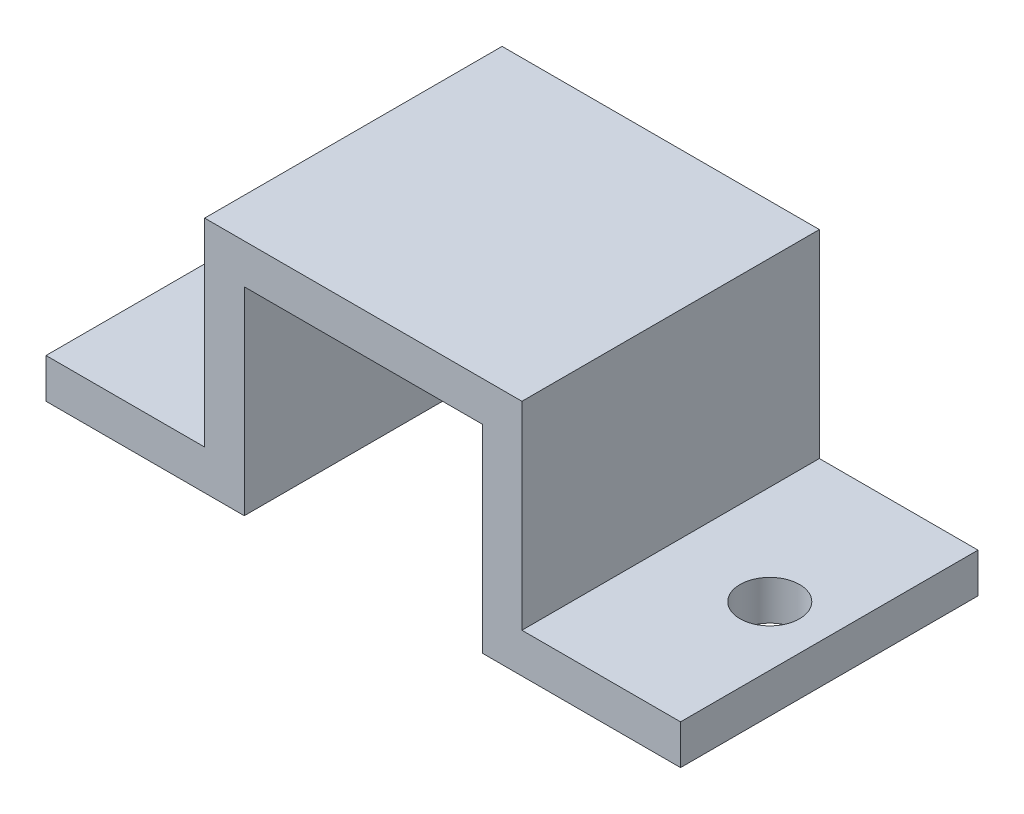
ISO-10303-21;
HEADER;
FILE_DESCRIPTION(('STEP AP214'),'2;1');
FILE_NAME('part.step','',(''),(''),'','','');
FILE_SCHEMA(('AUTOMOTIVE_DESIGN { 1 0 10303 214 1 1 1 1 }'));
ENDSEC;
DATA;
#1=APPLICATION_CONTEXT('core data for automotive mechanical design processes');
#2=APPLICATION_PROTOCOL_DEFINITION('international standard','automotive_design',2000,#1);
#3=PRODUCT_CONTEXT('',#1,'mechanical');
#4=PRODUCT('Part','Part','',(#3));
#5=PRODUCT_RELATED_PRODUCT_CATEGORY('part','',(#4));
#6=PRODUCT_DEFINITION_FORMATION('','',#4);
#7=PRODUCT_DEFINITION_CONTEXT('part definition',#1,'design');
#8=PRODUCT_DEFINITION('design','',#6,#7);
#9=PRODUCT_DEFINITION_SHAPE('','',#8);
#10=(LENGTH_UNIT() NAMED_UNIT(*) SI_UNIT(.MILLI.,.METRE.));
#11=(NAMED_UNIT(*) PLANE_ANGLE_UNIT() SI_UNIT($,.RADIAN.));
#12=(NAMED_UNIT(*) SI_UNIT($,.STERADIAN.) SOLID_ANGLE_UNIT());
#13=UNCERTAINTY_MEASURE_WITH_UNIT(LENGTH_MEASURE(1.E-05),#10,'distance_accuracy_value','');
#14=(GEOMETRIC_REPRESENTATION_CONTEXT(3) GLOBAL_UNCERTAINTY_ASSIGNED_CONTEXT((#13)) GLOBAL_UNIT_ASSIGNED_CONTEXT((#10,
#11,#12)) REPRESENTATION_CONTEXT('',''));
#15=CARTESIAN_POINT('',(0.,0.,0.));
#16=DIRECTION('',(0.,0.,1.));
#17=DIRECTION('',(1.,0.,0.));
#18=AXIS2_PLACEMENT_3D('',#15,#16,#17);
#19=CARTESIAN_POINT('',(0.,-4.,15.));
#20=DIRECTION('',(0.,1.,0.));
#21=DIRECTION('',(0.,0.,1.));
#22=AXIS2_PLACEMENT_3D('',#19,#20,#21);
#23=PLANE('',#22);
#24=CARTESIAN_POINT('',(13.,-4.,7.5));
#25=DIRECTION('',(0.,1.,0.));
#26=DIRECTION('',(0.,0.,1.));
#27=AXIS2_PLACEMENT_3D('',#24,#25,#26);
#28=CIRCLE('',#27,1.5);
#29=CARTESIAN_POINT('',(13.,-4.,9.));
#30=VERTEX_POINT('',#29);
#31=EDGE_CURVE('E202',#30,#30,#28,.T.);
#32=ORIENTED_EDGE('',*,*,#31,.F.);
#33=EDGE_LOOP('',(#32));
#34=FACE_BOUND('',#33,.T.);
#35=DIRECTION('',(1.,0.,0.));
#36=VECTOR('',#35,1.);
#37=CARTESIAN_POINT('',(0.,-4.,0.));
#38=LINE('',#37,#36);
#39=CARTESIAN_POINT('',(8.,-4.,0.));
#40=VERTEX_POINT('',#39);
#41=CARTESIAN_POINT('',(16.,-4.,0.));
#42=VERTEX_POINT('',#41);
#43=EDGE_CURVE('E213',#40,#42,#38,.T.);
#44=ORIENTED_EDGE('',*,*,#43,.F.);
#45=DIRECTION('',(0.,0.,-1.));
#46=VECTOR('',#45,1.);
#47=CARTESIAN_POINT('',(8.,-4.,15.));
#48=LINE('',#47,#46);
#49=CARTESIAN_POINT('',(8.,-4.,15.));
#50=VERTEX_POINT('',#49);
#51=EDGE_CURVE('E11',#50,#40,#48,.T.);
#52=ORIENTED_EDGE('',*,*,#51,.F.);
#53=DIRECTION('',(1.,0.,0.));
#54=VECTOR('',#53,1.);
#55=CARTESIAN_POINT('',(0.,-4.,15.));
#56=LINE('',#55,#54);
#57=CARTESIAN_POINT('',(16.,-4.,15.));
#58=VERTEX_POINT('',#57);
#59=EDGE_CURVE('E194',#50,#58,#56,.T.);
#60=ORIENTED_EDGE('',*,*,#59,.T.);
#61=DIRECTION('',(0.,0.,-1.));
#62=VECTOR('',#61,1.);
#63=CARTESIAN_POINT('',(16.,-4.,15.));
#64=LINE('',#63,#62);
#65=EDGE_CURVE('E110',#58,#42,#64,.T.);
#66=ORIENTED_EDGE('',*,*,#65,.T.);
#67=EDGE_LOOP('',(#44,#52,#60,#66));
#68=FACE_BOUND('',#67,.T.);
#69=ADVANCED_FACE('F47',(#34,#68),#23,.T.);
#70=CARTESIAN_POINT('',(8.,0.,15.));
#71=DIRECTION('',(1.,0.,0.));
#72=DIRECTION('',(0.,1.,0.));
#73=AXIS2_PLACEMENT_3D('',#70,#71,#72);
#74=PLANE('',#73);
#75=DIRECTION('',(0.,-1.,0.));
#76=VECTOR('',#75,1.);
#77=CARTESIAN_POINT('',(8.,0.,0.));
#78=LINE('',#77,#76);
#79=CARTESIAN_POINT('',(8.,6.,0.));
#80=VERTEX_POINT('',#79);
#81=EDGE_CURVE('E218',#80,#40,#78,.T.);
#82=ORIENTED_EDGE('',*,*,#81,.F.);
#83=DIRECTION('',(0.,0.,-1.));
#84=VECTOR('',#83,1.);
#85=CARTESIAN_POINT('',(8.,6.,15.));
#86=LINE('',#85,#84);
#87=CARTESIAN_POINT('',(8.,6.,15.));
#88=VERTEX_POINT('',#87);
#89=EDGE_CURVE('E56',#88,#80,#86,.T.);
#90=ORIENTED_EDGE('',*,*,#89,.F.);
#91=DIRECTION('',(0.,-1.,0.));
#92=VECTOR('',#91,1.);
#93=CARTESIAN_POINT('',(8.,0.,15.));
#94=LINE('',#93,#92);
#95=EDGE_CURVE('E190',#88,#50,#94,.T.);
#96=ORIENTED_EDGE('',*,*,#95,.T.);
#97=ORIENTED_EDGE('',*,*,#51,.T.);
#98=EDGE_LOOP('',(#82,#90,#96,#97));
#99=FACE_BOUND('',#98,.T.);
#100=ADVANCED_FACE('F293',(#99),#74,.T.);
#101=CARTESIAN_POINT('',(0.,6.,15.));
#102=DIRECTION('',(0.,-1.,0.));
#103=DIRECTION('',(0.,0.,-1.));
#104=AXIS2_PLACEMENT_3D('',#101,#102,#103);
#105=PLANE('',#104);
#106=DIRECTION('',(-1.,0.,0.));
#107=VECTOR('',#106,1.);
#108=CARTESIAN_POINT('',(0.,6.,0.));
#109=LINE('',#108,#107);
#110=CARTESIAN_POINT('',(-8.,6.,0.));
#111=VERTEX_POINT('',#110);
#112=EDGE_CURVE('E223',#80,#111,#109,.T.);
#113=ORIENTED_EDGE('',*,*,#112,.T.);
#114=DIRECTION('',(0.,0.,-1.));
#115=VECTOR('',#114,1.);
#116=CARTESIAN_POINT('',(-8.,6.,15.));
#117=LINE('',#116,#115);
#118=CARTESIAN_POINT('',(-8.,6.,15.));
#119=VERTEX_POINT('',#118);
#120=EDGE_CURVE('E278',#119,#111,#117,.T.);
#121=ORIENTED_EDGE('',*,*,#120,.F.);
#122=DIRECTION('',(-1.,0.,0.));
#123=VECTOR('',#122,1.);
#124=CARTESIAN_POINT('',(0.,6.,15.));
#125=LINE('',#124,#123);
#126=EDGE_CURVE('E187',#88,#119,#125,.T.);
#127=ORIENTED_EDGE('',*,*,#126,.F.);
#128=ORIENTED_EDGE('',*,*,#89,.T.);
#129=EDGE_LOOP('',(#113,#121,#127,#128));
#130=FACE_BOUND('',#129,.T.);
#131=ADVANCED_FACE('F285',(#130),#105,.F.);
#132=CARTESIAN_POINT('',(-8.,0.,15.));
#133=DIRECTION('',(1.,0.,0.));
#134=DIRECTION('',(0.,1.,0.));
#135=AXIS2_PLACEMENT_3D('',#132,#133,#134);
#136=PLANE('',#135);
#137=DIRECTION('',(0.,-1.,0.));
#138=VECTOR('',#137,1.);
#139=CARTESIAN_POINT('',(-8.,0.,0.));
#140=LINE('',#139,#138);
#141=CARTESIAN_POINT('',(-8.,-4.,0.));
#142=VERTEX_POINT('',#141);
#143=EDGE_CURVE('E228',#111,#142,#140,.T.);
#144=ORIENTED_EDGE('',*,*,#143,.T.);
#145=DIRECTION('',(0.,0.,-1.));
#146=VECTOR('',#145,1.);
#147=CARTESIAN_POINT('',(-8.,-4.,15.));
#148=LINE('',#147,#146);
#149=CARTESIAN_POINT('',(-8.,-4.,15.));
#150=VERTEX_POINT('',#149);
#151=EDGE_CURVE('E274',#150,#142,#148,.T.);
#152=ORIENTED_EDGE('',*,*,#151,.F.);
#153=DIRECTION('',(0.,-1.,0.));
#154=VECTOR('',#153,1.);
#155=CARTESIAN_POINT('',(-8.,0.,15.));
#156=LINE('',#155,#154);
#157=EDGE_CURVE('E182',#119,#150,#156,.T.);
#158=ORIENTED_EDGE('',*,*,#157,.F.);
#159=ORIENTED_EDGE('',*,*,#120,.T.);
#160=EDGE_LOOP('',(#144,#152,#158,#159));
#161=FACE_BOUND('',#160,.T.);
#162=ADVANCED_FACE('F340',(#161),#136,.F.);
#163=CARTESIAN_POINT('',(0.,-4.,15.));
#164=DIRECTION('',(0.,-1.,0.));
#165=DIRECTION('',(0.,0.,-1.));
#166=AXIS2_PLACEMENT_3D('',#163,#164,#165);
#167=PLANE('',#166);
#168=CARTESIAN_POINT('',(-13.,-4.,7.5));
#169=DIRECTION('',(0.,1.,0.));
#170=DIRECTION('',(0.,0.,1.));
#171=AXIS2_PLACEMENT_3D('',#168,#169,#170);
#172=CIRCLE('',#171,1.5);
#173=CARTESIAN_POINT('',(-13.,-4.,9.));
#174=VERTEX_POINT('',#173);
#175=EDGE_CURVE('E206',#174,#174,#172,.T.);
#176=ORIENTED_EDGE('',*,*,#175,.F.);
#177=EDGE_LOOP('',(#176));
#178=FACE_BOUND('',#177,.T.);
#179=DIRECTION('',(-1.,0.,0.));
#180=VECTOR('',#179,1.);
#181=CARTESIAN_POINT('',(0.,-4.,0.));
#182=LINE('',#181,#180);
#183=CARTESIAN_POINT('',(-16.,-4.,0.));
#184=VERTEX_POINT('',#183);
#185=EDGE_CURVE('E231',#142,#184,#182,.T.);
#186=ORIENTED_EDGE('',*,*,#185,.T.);
#187=DIRECTION('',(0.,0.,-1.));
#188=VECTOR('',#187,1.);
#189=CARTESIAN_POINT('',(-16.,-4.,15.));
#190=LINE('',#189,#188);
#191=CARTESIAN_POINT('',(-16.,-4.,15.));
#192=VERTEX_POINT('',#191);
#193=EDGE_CURVE('E271',#192,#184,#190,.T.);
#194=ORIENTED_EDGE('',*,*,#193,.F.);
#195=DIRECTION('',(-1.,0.,0.));
#196=VECTOR('',#195,1.);
#197=CARTESIAN_POINT('',(0.,-4.,15.));
#198=LINE('',#197,#196);
#199=EDGE_CURVE('E178',#150,#192,#198,.T.);
#200=ORIENTED_EDGE('',*,*,#199,.F.);
#201=ORIENTED_EDGE('',*,*,#151,.T.);
#202=EDGE_LOOP('',(#186,#194,#200,#201));
#203=FACE_BOUND('',#202,.T.);
#204=ADVANCED_FACE('F338',(#178,#203),#167,.F.);
#205=CARTESIAN_POINT('',(-16.,0.,15.));
#206=DIRECTION('',(-1.,0.,0.));
#207=DIRECTION('',(0.,0.,1.));
#208=AXIS2_PLACEMENT_3D('',#205,#206,#207);
#209=PLANE('',#208);
#210=DIRECTION('',(0.,1.,0.));
#211=VECTOR('',#210,1.);
#212=CARTESIAN_POINT('',(-16.,0.,0.));
#213=LINE('',#212,#211);
#214=CARTESIAN_POINT('',(-16.,-6.,0.));
#215=VERTEX_POINT('',#214);
#216=EDGE_CURVE('E235',#215,#184,#213,.T.);
#217=ORIENTED_EDGE('',*,*,#216,.F.);
#218=DIRECTION('',(0.,0.,-1.));
#219=VECTOR('',#218,1.);
#220=CARTESIAN_POINT('',(-16.,-6.,15.));
#221=LINE('',#220,#219);
#222=CARTESIAN_POINT('',(-16.,-6.,15.));
#223=VERTEX_POINT('',#222);
#224=EDGE_CURVE('E268',#223,#215,#221,.T.);
#225=ORIENTED_EDGE('',*,*,#224,.F.);
#226=DIRECTION('',(0.,1.,0.));
#227=VECTOR('',#226,1.);
#228=CARTESIAN_POINT('',(-16.,0.,15.));
#229=LINE('',#228,#227);
#230=EDGE_CURVE('E172',#223,#192,#229,.T.);
#231=ORIENTED_EDGE('',*,*,#230,.T.);
#232=ORIENTED_EDGE('',*,*,#193,.T.);
#233=EDGE_LOOP('',(#217,#225,#231,#232));
#234=FACE_BOUND('',#233,.T.);
#235=ADVANCED_FACE('F335',(#234),#209,.T.);
#236=CARTESIAN_POINT('',(0.,-6.,15.));
#237=DIRECTION('',(0.,-1.,0.));
#238=DIRECTION('',(0.,0.,-1.));
#239=AXIS2_PLACEMENT_3D('',#236,#237,#238);
#240=PLANE('',#239);
#241=CARTESIAN_POINT('',(-13.,-6.,7.5));
#242=DIRECTION('',(0.,1.,0.));
#243=DIRECTION('',(0.,0.,1.));
#244=AXIS2_PLACEMENT_3D('',#241,#242,#243);
#245=CIRCLE('',#244,1.5);
#246=CARTESIAN_POINT('',(-13.,-6.,9.));
#247=VERTEX_POINT('',#246);
#248=EDGE_CURVE('E210',#247,#247,#245,.T.);
#249=ORIENTED_EDGE('',*,*,#248,.T.);
#250=EDGE_LOOP('',(#249));
#251=FACE_BOUND('',#250,.T.);
#252=DIRECTION('',(-1.,0.,0.));
#253=VECTOR('',#252,1.);
#254=CARTESIAN_POINT('',(0.,-6.,0.));
#255=LINE('',#254,#253);
#256=CARTESIAN_POINT('',(-6.,-6.,0.));
#257=VERTEX_POINT('',#256);
#258=EDGE_CURVE('E239',#257,#215,#255,.T.);
#259=ORIENTED_EDGE('',*,*,#258,.F.);
#260=DIRECTION('',(0.,0.,-1.));
#261=VECTOR('',#260,1.);
#262=CARTESIAN_POINT('',(-6.,-6.,15.));
#263=LINE('',#262,#261);
#264=CARTESIAN_POINT('',(-6.,-6.,15.));
#265=VERTEX_POINT('',#264);
#266=EDGE_CURVE('E265',#265,#257,#263,.T.);
#267=ORIENTED_EDGE('',*,*,#266,.F.);
#268=DIRECTION('',(-1.,0.,0.));
#269=VECTOR('',#268,1.);
#270=CARTESIAN_POINT('',(0.,-6.,15.));
#271=LINE('',#270,#269);
#272=EDGE_CURVE('E164',#265,#223,#271,.T.);
#273=ORIENTED_EDGE('',*,*,#272,.T.);
#274=ORIENTED_EDGE('',*,*,#224,.T.);
#275=EDGE_LOOP('',(#259,#267,#273,#274));
#276=FACE_BOUND('',#275,.T.);
#277=ADVANCED_FACE('F324',(#251,#276),#240,.T.);
#278=CARTESIAN_POINT('',(-6.,0.,15.));
#279=DIRECTION('',(-1.,0.,0.));
#280=DIRECTION('',(0.,0.,1.));
#281=AXIS2_PLACEMENT_3D('',#278,#279,#280);
#282=PLANE('',#281);
#283=DIRECTION('',(0.,1.,0.));
#284=VECTOR('',#283,1.);
#285=CARTESIAN_POINT('',(-6.,0.,0.));
#286=LINE('',#285,#284);
#287=CARTESIAN_POINT('',(-6.,4.,0.));
#288=VERTEX_POINT('',#287);
#289=EDGE_CURVE('E243',#257,#288,#286,.T.);
#290=ORIENTED_EDGE('',*,*,#289,.T.);
#291=DIRECTION('',(0.,0.,-1.));
#292=VECTOR('',#291,1.);
#293=CARTESIAN_POINT('',(-6.,4.,15.));
#294=LINE('',#293,#292);
#295=CARTESIAN_POINT('',(-6.,4.,15.));
#296=VERTEX_POINT('',#295);
#297=EDGE_CURVE('E261',#296,#288,#294,.T.);
#298=ORIENTED_EDGE('',*,*,#297,.F.);
#299=DIRECTION('',(0.,1.,0.));
#300=VECTOR('',#299,1.);
#301=CARTESIAN_POINT('',(-6.,0.,15.));
#302=LINE('',#301,#300);
#303=EDGE_CURVE('E171',#265,#296,#302,.T.);
#304=ORIENTED_EDGE('',*,*,#303,.F.);
#305=ORIENTED_EDGE('',*,*,#266,.T.);
#306=EDGE_LOOP('',(#290,#298,#304,#305));
#307=FACE_BOUND('',#306,.T.);
#308=ADVANCED_FACE('F330',(#307),#282,.F.);
#309=CARTESIAN_POINT('',(0.,4.,15.));
#310=DIRECTION('',(0.,1.,0.));
#311=DIRECTION('',(0.,0.,1.));
#312=AXIS2_PLACEMENT_3D('',#309,#310,#311);
#313=PLANE('',#312);
#314=DIRECTION('',(1.,0.,0.));
#315=VECTOR('',#314,1.);
#316=CARTESIAN_POINT('',(0.,4.,0.));
#317=LINE('',#316,#315);
#318=CARTESIAN_POINT('',(6.,4.,0.));
#319=VERTEX_POINT('',#318);
#320=EDGE_CURVE('E247',#288,#319,#317,.T.);
#321=ORIENTED_EDGE('',*,*,#320,.T.);
#322=DIRECTION('',(0.,0.,-1.));
#323=VECTOR('',#322,1.);
#324=CARTESIAN_POINT('',(6.,4.,15.));
#325=LINE('',#324,#323);
#326=CARTESIAN_POINT('',(6.,4.,15.));
#327=VERTEX_POINT('',#326);
#328=EDGE_CURVE('E152',#327,#319,#325,.T.);
#329=ORIENTED_EDGE('',*,*,#328,.F.);
#330=DIRECTION('',(1.,0.,0.));
#331=VECTOR('',#330,1.);
#332=CARTESIAN_POINT('',(0.,4.,15.));
#333=LINE('',#332,#331);
#334=EDGE_CURVE('E157',#296,#327,#333,.T.);
#335=ORIENTED_EDGE('',*,*,#334,.F.);
#336=ORIENTED_EDGE('',*,*,#297,.T.);
#337=EDGE_LOOP('',(#321,#329,#335,#336));
#338=FACE_BOUND('',#337,.T.);
#339=ADVANCED_FACE('F327',(#338),#313,.F.);
#340=CARTESIAN_POINT('',(6.,0.,15.));
#341=DIRECTION('',(-1.,0.,0.));
#342=DIRECTION('',(0.,0.,1.));
#343=AXIS2_PLACEMENT_3D('',#340,#341,#342);
#344=PLANE('',#343);
#345=DIRECTION('',(0.,1.,0.));
#346=VECTOR('',#345,1.);
#347=CARTESIAN_POINT('',(6.,0.,0.));
#348=LINE('',#347,#346);
#349=CARTESIAN_POINT('',(6.,-6.,0.));
#350=VERTEX_POINT('',#349);
#351=EDGE_CURVE('E146',#350,#319,#348,.T.);
#352=ORIENTED_EDGE('',*,*,#351,.F.);
#353=DIRECTION('',(0.,0.,-1.));
#354=VECTOR('',#353,1.);
#355=CARTESIAN_POINT('',(6.,-6.,15.));
#356=LINE('',#355,#354);
#357=CARTESIAN_POINT('',(6.,-6.,15.));
#358=VERTEX_POINT('',#357);
#359=EDGE_CURVE('E141',#358,#350,#356,.T.);
#360=ORIENTED_EDGE('',*,*,#359,.F.);
#361=DIRECTION('',(0.,1.,0.));
#362=VECTOR('',#361,1.);
#363=CARTESIAN_POINT('',(6.,0.,15.));
#364=LINE('',#363,#362);
#365=EDGE_CURVE('E144',#358,#327,#364,.T.);
#366=ORIENTED_EDGE('',*,*,#365,.T.);
#367=ORIENTED_EDGE('',*,*,#328,.T.);
#368=EDGE_LOOP('',(#352,#360,#366,#367));
#369=FACE_BOUND('',#368,.T.);
#370=ADVANCED_FACE('F143',(#369),#344,.T.);
#371=CARTESIAN_POINT('',(13.,-6.,7.5));
#372=DIRECTION('',(0.,1.,0.));
#373=DIRECTION('',(0.,0.,1.));
#374=AXIS2_PLACEMENT_3D('',#371,#372,#373);
#375=CIRCLE('',#374,1.5);
#376=CARTESIAN_POINT('',(13.,-6.,9.));
#377=VERTEX_POINT('',#376);
#378=EDGE_CURVE('E198',#377,#377,#375,.T.);
#379=ORIENTED_EDGE('',*,*,#378,.T.);
#380=EDGE_LOOP('',(#379));
#381=FACE_BOUND('',#380,.T.);
#382=CARTESIAN_POINT('',(16.,-6.,0.));
#383=VERTEX_POINT('',#382);
#384=EDGE_CURVE('E244',#383,#350,#255,.T.);
#385=ORIENTED_EDGE('',*,*,#384,.F.);
#386=DIRECTION('',(0.,0.,-1.));
#387=VECTOR('',#386,1.);
#388=CARTESIAN_POINT('',(16.,-6.,15.));
#389=LINE('',#388,#387);
#390=CARTESIAN_POINT('',(16.,-6.,15.));
#391=VERTEX_POINT('',#390);
#392=EDGE_CURVE('E103',#391,#383,#389,.T.);
#393=ORIENTED_EDGE('',*,*,#392,.F.);
#394=EDGE_CURVE('E155',#391,#358,#271,.T.);
#395=ORIENTED_EDGE('',*,*,#394,.T.);
#396=ORIENTED_EDGE('',*,*,#359,.T.);
#397=EDGE_LOOP('',(#385,#393,#395,#396));
#398=FACE_BOUND('',#397,.T.);
#399=ADVANCED_FACE('F161',(#381,#398),#240,.T.);
#400=CARTESIAN_POINT('',(16.,0.,15.));
#401=DIRECTION('',(-1.,0.,0.));
#402=DIRECTION('',(0.,0.,1.));
#403=AXIS2_PLACEMENT_3D('',#400,#401,#402);
#404=PLANE('',#403);
#405=DIRECTION('',(0.,1.,0.));
#406=VECTOR('',#405,1.);
#407=CARTESIAN_POINT('',(16.,0.,0.));
#408=LINE('',#407,#406);
#409=EDGE_CURVE('E197',#383,#42,#408,.T.);
#410=ORIENTED_EDGE('',*,*,#409,.T.);
#411=ORIENTED_EDGE('',*,*,#65,.F.);
#412=DIRECTION('',(0.,1.,0.));
#413=VECTOR('',#412,1.);
#414=CARTESIAN_POINT('',(16.,0.,15.));
#415=LINE('',#414,#413);
#416=EDGE_CURVE('E64',#391,#58,#415,.T.);
#417=ORIENTED_EDGE('',*,*,#416,.F.);
#418=ORIENTED_EDGE('',*,*,#392,.T.);
#419=EDGE_LOOP('',(#410,#411,#417,#418));
#420=FACE_BOUND('',#419,.T.);
#421=ADVANCED_FACE('F318',(#420),#404,.F.);
#422=CARTESIAN_POINT('',(0.,0.,15.));
#423=DIRECTION('',(0.,0.,1.));
#424=DIRECTION('',(1.,0.,0.));
#425=AXIS2_PLACEMENT_3D('',#422,#423,#424);
#426=PLANE('',#425);
#427=ORIENTED_EDGE('',*,*,#59,.F.);
#428=ORIENTED_EDGE('',*,*,#95,.F.);
#429=ORIENTED_EDGE('',*,*,#126,.T.);
#430=ORIENTED_EDGE('',*,*,#157,.T.);
#431=ORIENTED_EDGE('',*,*,#199,.T.);
#432=ORIENTED_EDGE('',*,*,#230,.F.);
#433=ORIENTED_EDGE('',*,*,#272,.F.);
#434=ORIENTED_EDGE('',*,*,#303,.T.);
#435=ORIENTED_EDGE('',*,*,#334,.T.);
#436=ORIENTED_EDGE('',*,*,#365,.F.);
#437=ORIENTED_EDGE('',*,*,#394,.F.);
#438=ORIENTED_EDGE('',*,*,#416,.T.);
#439=EDGE_LOOP('',(#427,#428,#429,#430,#431,#432,#433,#434,#435,#436,#437,#438));
#440=FACE_BOUND('',#439,.T.);
#441=ADVANCED_FACE('F154',(#440),#426,.T.);
#442=CARTESIAN_POINT('',(0.,0.,0.));
#443=DIRECTION('',(0.,0.,1.));
#444=DIRECTION('',(1.,0.,0.));
#445=AXIS2_PLACEMENT_3D('',#442,#443,#444);
#446=PLANE('',#445);
#447=ORIENTED_EDGE('',*,*,#43,.T.);
#448=ORIENTED_EDGE('',*,*,#409,.F.);
#449=ORIENTED_EDGE('',*,*,#384,.T.);
#450=ORIENTED_EDGE('',*,*,#351,.T.);
#451=ORIENTED_EDGE('',*,*,#320,.F.);
#452=ORIENTED_EDGE('',*,*,#289,.F.);
#453=ORIENTED_EDGE('',*,*,#258,.T.);
#454=ORIENTED_EDGE('',*,*,#216,.T.);
#455=ORIENTED_EDGE('',*,*,#185,.F.);
#456=ORIENTED_EDGE('',*,*,#143,.F.);
#457=ORIENTED_EDGE('',*,*,#112,.F.);
#458=ORIENTED_EDGE('',*,*,#81,.T.);
#459=EDGE_LOOP('',(#447,#448,#449,#450,#451,#452,#453,#454,#455,#456,#457,#458));
#460=FACE_BOUND('',#459,.T.);
#461=ADVANCED_FACE('F291',(#460),#446,.F.);
#462=CARTESIAN_POINT('',(13.,-6.,7.5));
#463=DIRECTION('',(0.,1.,0.));
#464=DIRECTION('',(0.,0.,1.));
#465=AXIS2_PLACEMENT_3D('',#462,#463,#464);
#466=CYLINDRICAL_SURFACE('',#465,1.5);
#467=ORIENTED_EDGE('',*,*,#378,.F.);
#468=EDGE_LOOP('',(#467));
#469=FACE_BOUND('',#468,.T.);
#470=ORIENTED_EDGE('',*,*,#31,.T.);
#471=EDGE_LOOP('',(#470));
#472=FACE_BOUND('',#471,.T.);
#473=ADVANCED_FACE('F303',(#469,#472),#466,.F.);
#474=CARTESIAN_POINT('',(-13.,-6.,7.5));
#475=DIRECTION('',(0.,1.,0.));
#476=DIRECTION('',(0.,0.,1.));
#477=AXIS2_PLACEMENT_3D('',#474,#475,#476);
#478=CYLINDRICAL_SURFACE('',#477,1.5);
#479=ORIENTED_EDGE('',*,*,#248,.F.);
#480=EDGE_LOOP('',(#479));
#481=FACE_BOUND('',#480,.T.);
#482=ORIENTED_EDGE('',*,*,#175,.T.);
#483=EDGE_LOOP('',(#482));
#484=FACE_BOUND('',#483,.T.);
#485=ADVANCED_FACE('F305',(#481,#484),#478,.F.);
#486=CLOSED_SHELL('',(#69,#100,#131,#162,#204,#235,#277,#308,#339,#370,#399,#421,#441,#461,#473,#485));
#487=MANIFOLD_SOLID_BREP('B2',#486);
#488=ADVANCED_BREP_SHAPE_REPRESENTATION('',(#18,#487),#14);
#489=SHAPE_DEFINITION_REPRESENTATION(#9,#488);
ENDSEC;
END-ISO-10303-21;
